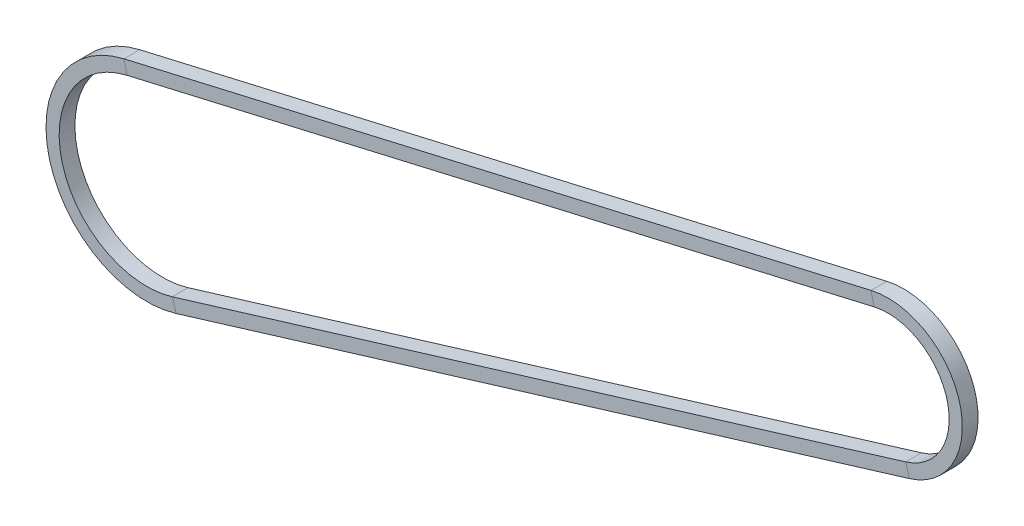
ISO-10303-21;
HEADER;
FILE_DESCRIPTION(('STEP AP214'),'2;1');
FILE_NAME('part.step','',(''),(''),'','','');
FILE_SCHEMA(('AUTOMOTIVE_DESIGN { 1 0 10303 214 1 1 1 1 }'));
ENDSEC;
DATA;
#1=APPLICATION_CONTEXT('core data for automotive mechanical design processes');
#2=APPLICATION_PROTOCOL_DEFINITION('international standard','automotive_design',2000,#1);
#3=PRODUCT_CONTEXT('',#1,'mechanical');
#4=PRODUCT('Part','Part','',(#3));
#5=PRODUCT_RELATED_PRODUCT_CATEGORY('part','',(#4));
#6=PRODUCT_DEFINITION_FORMATION('','',#4);
#7=PRODUCT_DEFINITION_CONTEXT('part definition',#1,'design');
#8=PRODUCT_DEFINITION('design','',#6,#7);
#9=PRODUCT_DEFINITION_SHAPE('','',#8);
#10=(LENGTH_UNIT() NAMED_UNIT(*) SI_UNIT(.MILLI.,.METRE.));
#11=(NAMED_UNIT(*) PLANE_ANGLE_UNIT() SI_UNIT($,.RADIAN.));
#12=(NAMED_UNIT(*) SI_UNIT($,.STERADIAN.) SOLID_ANGLE_UNIT());
#13=UNCERTAINTY_MEASURE_WITH_UNIT(LENGTH_MEASURE(1.E-05),#10,'distance_accuracy_value','');
#14=(GEOMETRIC_REPRESENTATION_CONTEXT(3) GLOBAL_UNCERTAINTY_ASSIGNED_CONTEXT((#13)) GLOBAL_UNIT_ASSIGNED_CONTEXT((#10,
#11,#12)) REPRESENTATION_CONTEXT('',''));
#15=CARTESIAN_POINT('',(0.,0.,0.));
#16=DIRECTION('',(0.,0.,1.));
#17=DIRECTION('',(1.,0.,0.));
#18=AXIS2_PLACEMENT_3D('',#15,#16,#17);
#19=CARTESIAN_POINT('',(-42.2936856202204,-11.3325589068733,0.));
#20=DIRECTION('',(0.,0.,-1.));
#21=DIRECTION('',(-1.,0.,0.));
#22=AXIS2_PLACEMENT_3D('',#19,#20,#21);
#23=CYLINDRICAL_SURFACE('',#22,5.74999999999999);
#24=CARTESIAN_POINT('',(-42.2936856202204,-11.3325589068733,-0.45));
#25=DIRECTION('',(0.,0.,-1.));
#26=DIRECTION('',(0.291757622308193,-0.956492284247536,0.));
#27=AXIS2_PLACEMENT_3D('',#24,#25,#26);
#28=CIRCLE('',#27,5.74999999999999);
#29=CARTESIAN_POINT('',(-40.6160792919483,-16.8323895412966,-0.45));
#30=VERTEX_POINT('',#29);
#31=CARTESIAN_POINT('',(-43.590751239599,-5.73076269681473,-0.45));
#32=VERTEX_POINT('',#31);
#33=EDGE_CURVE('E11',#30,#32,#28,.T.);
#34=ORIENTED_EDGE('',*,*,#33,.F.);
#35=DIRECTION('',(0.,0.,1.));
#36=VECTOR('',#35,1.);
#37=CARTESIAN_POINT('',(-40.6160792919483,-16.8323895412966,0.45));
#38=LINE('',#37,#36);
#39=CARTESIAN_POINT('',(-40.6160792919483,-16.8323895412966,0.45));
#40=VERTEX_POINT('',#39);
#41=EDGE_CURVE('E42',#30,#40,#38,.T.);
#42=ORIENTED_EDGE('',*,*,#41,.T.);
#43=CARTESIAN_POINT('',(-42.2936856202204,-11.3325589068733,0.45));
#44=DIRECTION('',(0.,0.,-1.));
#45=DIRECTION('',(0.291757622308193,-0.956492284247536,0.));
#46=AXIS2_PLACEMENT_3D('',#43,#44,#45);
#47=CIRCLE('',#46,5.74999999999999);
#48=CARTESIAN_POINT('',(-43.590751239599,-5.73076269681473,0.45));
#49=VERTEX_POINT('',#48);
#50=EDGE_CURVE('E124',#40,#49,#47,.T.);
#51=ORIENTED_EDGE('',*,*,#50,.T.);
#52=DIRECTION('',(0.,0.,1.));
#53=VECTOR('',#52,1.);
#54=CARTESIAN_POINT('',(-43.590751239599,-5.73076269681473,0.45));
#55=LINE('',#54,#53);
#56=EDGE_CURVE('E127',#32,#49,#55,.T.);
#57=ORIENTED_EDGE('',*,*,#56,.F.);
#58=EDGE_LOOP('',(#34,#42,#51,#57));
#59=FACE_BOUND('',#58,.T.);
#60=ADVANCED_FACE('F39',(#59),#23,.T.);
#61=CARTESIAN_POINT('',(-40.6160792919483,-16.8323895412966,-0.45));
#62=DIRECTION('',(0.,0.,-1.));
#63=DIRECTION('',(-1.,0.,0.));
#64=AXIS2_PLACEMENT_3D('',#61,#62,#63);
#65=PLANE('',#64);
#66=CARTESIAN_POINT('',(-42.2936856202204,-11.3325589068733,-0.45));
#67=DIRECTION('',(0.,0.,-1.));
#68=DIRECTION('',(0.291757622308195,-0.956492284247536,0.));
#69=AXIS2_PLACEMENT_3D('',#66,#67,#68);
#70=CIRCLE('',#69,5.);
#71=CARTESIAN_POINT('',(-40.8348975086795,-16.1150203281109,-0.45));
#72=VERTEX_POINT('',#71);
#73=CARTESIAN_POINT('',(-43.4215687675061,-6.46143176769193,-0.45));
#74=VERTEX_POINT('',#73);
#75=EDGE_CURVE('E47',#72,#74,#70,.T.);
#76=ORIENTED_EDGE('',*,*,#75,.F.);
#77=DIRECTION('',(0.291757622308196,-0.956492284247535,0.));
#78=VECTOR('',#77,1.);
#79=CARTESIAN_POINT('',(-40.6160792919483,-16.8323895412966,-0.45));
#80=LINE('',#79,#78);
#81=EDGE_CURVE('E193',#72,#30,#80,.T.);
#82=ORIENTED_EDGE('',*,*,#81,.T.);
#83=ORIENTED_EDGE('',*,*,#33,.T.);
#84=DIRECTION('',(-0.225576629457139,0.974225427836267,0.));
#85=VECTOR('',#84,1.);
#86=CARTESIAN_POINT('',(-43.590751239599,-5.73076269681473,-0.45));
#87=LINE('',#86,#85);
#88=EDGE_CURVE('E152',#74,#32,#87,.T.);
#89=ORIENTED_EDGE('',*,*,#88,.F.);
#90=EDGE_LOOP('',(#76,#82,#83,#89));
#91=FACE_BOUND('',#90,.T.);
#92=ADVANCED_FACE('F233',(#91),#65,.T.);
#93=CARTESIAN_POINT('',(-42.2936856202204,-11.3325589068733,0.));
#94=DIRECTION('',(0.,0.,-1.));
#95=DIRECTION('',(-1.,0.,0.));
#96=AXIS2_PLACEMENT_3D('',#93,#94,#95);
#97=CYLINDRICAL_SURFACE('',#96,5.);
#98=CARTESIAN_POINT('',(-42.2936856202204,-11.3325589068733,0.45));
#99=DIRECTION('',(0.,0.,-1.));
#100=DIRECTION('',(0.291757622308195,-0.956492284247536,0.));
#101=AXIS2_PLACEMENT_3D('',#98,#99,#100);
#102=CIRCLE('',#101,5.);
#103=CARTESIAN_POINT('',(-40.8348975086795,-16.1150203281109,0.45));
#104=VERTEX_POINT('',#103);
#105=CARTESIAN_POINT('',(-43.4215687675061,-6.46143176769193,0.45));
#106=VERTEX_POINT('',#105);
#107=EDGE_CURVE('E133',#104,#106,#102,.T.);
#108=ORIENTED_EDGE('',*,*,#107,.F.);
#109=DIRECTION('',(0.,0.,-1.));
#110=VECTOR('',#109,1.);
#111=CARTESIAN_POINT('',(-40.8348975086795,-16.1150203281109,0.45));
#112=LINE('',#111,#110);
#113=EDGE_CURVE('E177',#104,#72,#112,.T.);
#114=ORIENTED_EDGE('',*,*,#113,.T.);
#115=ORIENTED_EDGE('',*,*,#75,.T.);
#116=DIRECTION('',(0.,0.,-1.));
#117=VECTOR('',#116,1.);
#118=CARTESIAN_POINT('',(-43.4215687675061,-6.46143176769193,0.45));
#119=LINE('',#118,#117);
#120=EDGE_CURVE('E157',#106,#74,#119,.T.);
#121=ORIENTED_EDGE('',*,*,#120,.F.);
#122=EDGE_LOOP('',(#108,#114,#115,#121));
#123=FACE_BOUND('',#122,.T.);
#124=ADVANCED_FACE('F229',(#123),#97,.F.);
#125=CARTESIAN_POINT('',(1.23996989480991,-4.06509220805125,0.45));
#126=DIRECTION('',(0.291757622308192,-0.956492284247537,0.));
#127=DIRECTION('',(0.956492284247537,0.291757622308192,0.));
#128=AXIS2_PLACEMENT_3D('',#125,#126,#127);
#129=PLANE('',#128);
#130=ORIENTED_EDGE('',*,*,#41,.F.);
#131=DIRECTION('',(-0.956492284247537,-0.291757622308192,0.));
#132=VECTOR('',#131,1.);
#133=CARTESIAN_POINT('',(1.23996989480991,-4.06509220805125,-0.45));
#134=LINE('',#133,#132);
#135=CARTESIAN_POINT('',(1.2399698948099,-4.06509220805125,-0.45));
#136=VERTEX_POINT('',#135);
#137=EDGE_CURVE('E55',#136,#30,#134,.T.);
#138=ORIENTED_EDGE('',*,*,#137,.F.);
#139=DIRECTION('',(0.,0.,1.));
#140=VECTOR('',#139,1.);
#141=CARTESIAN_POINT('',(1.23996989480991,-4.06509220805126,0.45));
#142=LINE('',#141,#140);
#143=CARTESIAN_POINT('',(1.2399698948099,-4.06509220805125,0.45));
#144=VERTEX_POINT('',#143);
#145=EDGE_CURVE('E181',#136,#144,#142,.T.);
#146=ORIENTED_EDGE('',*,*,#145,.T.);
#147=DIRECTION('',(-0.956492284247537,-0.291757622308192,0.));
#148=VECTOR('',#147,1.);
#149=CARTESIAN_POINT('',(1.23996989480991,-4.06509220805125,0.45));
#150=LINE('',#149,#148);
#151=EDGE_CURVE('E179',#144,#40,#150,.T.);
#152=ORIENTED_EDGE('',*,*,#151,.T.);
#153=EDGE_LOOP('',(#130,#138,#146,#152));
#154=FACE_BOUND('',#153,.T.);
#155=ADVANCED_FACE('F208',(#154),#129,.T.);
#156=CARTESIAN_POINT('',(1.23996989480991,-4.06509220805125,-0.45));
#157=DIRECTION('',(0.,0.,-1.));
#158=DIRECTION('',(0.,1.,0.));
#159=AXIS2_PLACEMENT_3D('',#156,#157,#158);
#160=PLANE('',#159);
#161=ORIENTED_EDGE('',*,*,#137,.T.);
#162=ORIENTED_EDGE('',*,*,#81,.F.);
#163=DIRECTION('',(-0.956492284247537,-0.291757622308192,0.));
#164=VECTOR('',#163,1.);
#165=CARTESIAN_POINT('',(1.02115167807876,-3.3477229948656,-0.45));
#166=LINE('',#165,#164);
#167=CARTESIAN_POINT('',(1.02115167807876,-3.3477229948656,-0.45));
#168=VERTEX_POINT('',#167);
#169=EDGE_CURVE('E64',#168,#72,#166,.T.);
#170=ORIENTED_EDGE('',*,*,#169,.F.);
#171=DIRECTION('',(0.291757622308196,-0.956492284247535,0.));
#172=VECTOR('',#171,1.);
#173=CARTESIAN_POINT('',(1.23996989480991,-4.06509220805126,-0.45));
#174=LINE('',#173,#172);
#175=EDGE_CURVE('E190',#168,#136,#174,.T.);
#176=ORIENTED_EDGE('',*,*,#175,.T.);
#177=EDGE_LOOP('',(#161,#162,#170,#176));
#178=FACE_BOUND('',#177,.T.);
#179=ADVANCED_FACE('F219',(#178),#160,.T.);
#180=CARTESIAN_POINT('',(1.02115167807876,-3.3477229948656,0.45));
#181=DIRECTION('',(-0.291757622308192,0.956492284247537,0.));
#182=DIRECTION('',(-0.956492284247537,-0.291757622308192,0.));
#183=AXIS2_PLACEMENT_3D('',#180,#181,#182);
#184=PLANE('',#183);
#185=ORIENTED_EDGE('',*,*,#169,.T.);
#186=ORIENTED_EDGE('',*,*,#113,.F.);
#187=DIRECTION('',(-0.956492284247537,-0.291757622308192,0.));
#188=VECTOR('',#187,1.);
#189=CARTESIAN_POINT('',(1.02115167807876,-3.3477229948656,0.45));
#190=LINE('',#189,#188);
#191=CARTESIAN_POINT('',(1.02115167807876,-3.3477229948656,0.45));
#192=VERTEX_POINT('',#191);
#193=EDGE_CURVE('E92',#192,#104,#190,.T.);
#194=ORIENTED_EDGE('',*,*,#193,.F.);
#195=DIRECTION('',(0.,0.,-1.));
#196=VECTOR('',#195,1.);
#197=CARTESIAN_POINT('',(1.02115167807876,-3.3477229948656,0.45));
#198=LINE('',#197,#196);
#199=EDGE_CURVE('E171',#192,#168,#198,.T.);
#200=ORIENTED_EDGE('',*,*,#199,.T.);
#201=EDGE_LOOP('',(#185,#186,#194,#200));
#202=FACE_BOUND('',#201,.T.);
#203=ADVANCED_FACE('F221',(#202),#184,.T.);
#204=CARTESIAN_POINT('',(1.23996989480991,-4.06509220805125,0.45));
#205=DIRECTION('',(0.,0.,1.));
#206=DIRECTION('',(0.,-1.,0.));
#207=AXIS2_PLACEMENT_3D('',#204,#205,#206);
#208=PLANE('',#207);
#209=ORIENTED_EDGE('',*,*,#193,.T.);
#210=DIRECTION('',(-0.291757622308196,0.956492284247535,0.));
#211=VECTOR('',#210,1.);
#212=CARTESIAN_POINT('',(-40.6160792919483,-16.8323895412966,0.45));
#213=LINE('',#212,#211);
#214=EDGE_CURVE('E175',#40,#104,#213,.T.);
#215=ORIENTED_EDGE('',*,*,#214,.F.);
#216=ORIENTED_EDGE('',*,*,#151,.F.);
#217=DIRECTION('',(-0.291757622308196,0.956492284247535,0.));
#218=VECTOR('',#217,1.);
#219=CARTESIAN_POINT('',(1.23996989480991,-4.06509220805126,0.45));
#220=LINE('',#219,#218);
#221=EDGE_CURVE('E166',#144,#192,#220,.T.);
#222=ORIENTED_EDGE('',*,*,#221,.T.);
#223=EDGE_LOOP('',(#209,#215,#216,#222));
#224=FACE_BOUND('',#223,.T.);
#225=ADVANCED_FACE('F227',(#224),#208,.T.);
#226=CARTESIAN_POINT('',(0.,7.72017187502153E-13,0.));
#227=DIRECTION('',(0.,0.,-1.));
#228=DIRECTION('',(-1.,0.,0.));
#229=AXIS2_PLACEMENT_3D('',#226,#227,#228);
#230=CYLINDRICAL_SURFACE('',#229,4.24999999999999);
#231=ORIENTED_EDGE('',*,*,#145,.F.);
#232=CARTESIAN_POINT('',(0.,7.72017187502153E-13,-0.45));
#233=DIRECTION('',(0.,0.,-1.));
#234=DIRECTION('',(-0.22557662945714,0.974225427836266,0.));
#235=AXIS2_PLACEMENT_3D('',#232,#233,#234);
#236=CIRCLE('',#235,4.24999999999999);
#237=CARTESIAN_POINT('',(-0.958700675192783,4.1404580683049,-0.45));
#238=VERTEX_POINT('',#237);
#239=EDGE_CURVE('E200',#238,#136,#236,.T.);
#240=ORIENTED_EDGE('',*,*,#239,.F.);
#241=DIRECTION('',(0.,0.,1.));
#242=VECTOR('',#241,1.);
#243=CARTESIAN_POINT('',(-0.958700675192776,4.14045806830491,0.45));
#244=LINE('',#243,#242);
#245=CARTESIAN_POINT('',(-0.958700675192783,4.1404580683049,0.45));
#246=VERTEX_POINT('',#245);
#247=EDGE_CURVE('E174',#238,#246,#244,.T.);
#248=ORIENTED_EDGE('',*,*,#247,.T.);
#249=CARTESIAN_POINT('',(0.,7.72017187502153E-13,0.45));
#250=DIRECTION('',(0.,0.,-1.));
#251=DIRECTION('',(-0.22557662945714,0.974225427836266,0.));
#252=AXIS2_PLACEMENT_3D('',#249,#250,#251);
#253=CIRCLE('',#252,4.24999999999999);
#254=EDGE_CURVE('E169',#246,#144,#253,.T.);
#255=ORIENTED_EDGE('',*,*,#254,.T.);
#256=EDGE_LOOP('',(#231,#240,#248,#255));
#257=FACE_BOUND('',#256,.T.);
#258=ADVANCED_FACE('F213',(#257),#230,.T.);
#259=CARTESIAN_POINT('',(-0.95870067519277,4.1404580683049,-0.45));
#260=DIRECTION('',(0.,0.,-1.));
#261=DIRECTION('',(-1.,0.,0.));
#262=AXIS2_PLACEMENT_3D('',#259,#260,#261);
#263=PLANE('',#262);
#264=ORIENTED_EDGE('',*,*,#239,.T.);
#265=ORIENTED_EDGE('',*,*,#175,.F.);
#266=CARTESIAN_POINT('',(0.,7.72017187502153E-13,-0.45));
#267=DIRECTION('',(0.,0.,-1.));
#268=DIRECTION('',(-0.225576629457141,0.974225427836266,0.));
#269=AXIS2_PLACEMENT_3D('',#266,#267,#268);
#270=CIRCLE('',#269,3.49999999999999);
#271=CARTESIAN_POINT('',(-0.789518203099929,3.4097889974277,-0.45));
#272=VERTEX_POINT('',#271);
#273=EDGE_CURVE('E105',#272,#168,#270,.T.);
#274=ORIENTED_EDGE('',*,*,#273,.F.);
#275=DIRECTION('',(-0.225576629457139,0.974225427836267,0.));
#276=VECTOR('',#275,1.);
#277=CARTESIAN_POINT('',(-0.958700675192776,4.14045806830491,-0.45));
#278=LINE('',#277,#276);
#279=EDGE_CURVE('E187',#272,#238,#278,.T.);
#280=ORIENTED_EDGE('',*,*,#279,.T.);
#281=EDGE_LOOP('',(#264,#265,#274,#280));
#282=FACE_BOUND('',#281,.T.);
#283=ADVANCED_FACE('F218',(#282),#263,.T.);
#284=CARTESIAN_POINT('',(0.,7.72017187502153E-13,0.));
#285=DIRECTION('',(0.,0.,-1.));
#286=DIRECTION('',(-1.,0.,0.));
#287=AXIS2_PLACEMENT_3D('',#284,#285,#286);
#288=CYLINDRICAL_SURFACE('',#287,3.49999999999999);
#289=ORIENTED_EDGE('',*,*,#273,.T.);
#290=ORIENTED_EDGE('',*,*,#199,.F.);
#291=CARTESIAN_POINT('',(0.,7.72017187502153E-13,0.45));
#292=DIRECTION('',(0.,0.,-1.));
#293=DIRECTION('',(-0.225576629457141,0.974225427836266,0.));
#294=AXIS2_PLACEMENT_3D('',#291,#292,#293);
#295=CIRCLE('',#294,3.49999999999999);
#296=CARTESIAN_POINT('',(-0.789518203099929,3.4097889974277,0.45));
#297=VERTEX_POINT('',#296);
#298=EDGE_CURVE('E111',#297,#192,#295,.T.);
#299=ORIENTED_EDGE('',*,*,#298,.F.);
#300=DIRECTION('',(0.,0.,-1.));
#301=VECTOR('',#300,1.);
#302=CARTESIAN_POINT('',(-0.789518203099922,3.40978899742771,0.45));
#303=LINE('',#302,#301);
#304=EDGE_CURVE('E164',#297,#272,#303,.T.);
#305=ORIENTED_EDGE('',*,*,#304,.T.);
#306=EDGE_LOOP('',(#289,#290,#299,#305));
#307=FACE_BOUND('',#306,.T.);
#308=ADVANCED_FACE('F251',(#307),#288,.F.);
#309=CARTESIAN_POINT('',(-0.95870067519277,4.1404580683049,0.45));
#310=DIRECTION('',(0.,0.,1.));
#311=DIRECTION('',(1.,0.,0.));
#312=AXIS2_PLACEMENT_3D('',#309,#310,#311);
#313=PLANE('',#312);
#314=ORIENTED_EDGE('',*,*,#298,.T.);
#315=ORIENTED_EDGE('',*,*,#221,.F.);
#316=ORIENTED_EDGE('',*,*,#254,.F.);
#317=DIRECTION('',(0.225576629457139,-0.974225427836267,0.));
#318=VECTOR('',#317,1.);
#319=CARTESIAN_POINT('',(-0.958700675192776,4.14045806830491,0.45));
#320=LINE('',#319,#318);
#321=EDGE_CURVE('E144',#246,#297,#320,.T.);
#322=ORIENTED_EDGE('',*,*,#321,.T.);
#323=EDGE_LOOP('',(#314,#315,#316,#322));
#324=FACE_BOUND('',#323,.T.);
#325=ADVANCED_FACE('F211',(#324),#313,.T.);
#326=CARTESIAN_POINT('',(-43.590751239599,-5.73076269681473,0.45));
#327=DIRECTION('',(-0.225576629457135,0.974225427836267,0.));
#328=DIRECTION('',(-0.974225427836268,-0.225576629457135,0.));
#329=AXIS2_PLACEMENT_3D('',#326,#327,#328);
#330=PLANE('',#329);
#331=ORIENTED_EDGE('',*,*,#247,.F.);
#332=DIRECTION('',(0.974225427836267,0.225576629457135,0.));
#333=VECTOR('',#332,1.);
#334=CARTESIAN_POINT('',(-43.590751239599,-5.73076269681473,-0.45));
#335=LINE('',#334,#333);
#336=EDGE_CURVE('E151',#32,#238,#335,.T.);
#337=ORIENTED_EDGE('',*,*,#336,.F.);
#338=ORIENTED_EDGE('',*,*,#56,.T.);
#339=DIRECTION('',(0.974225427836267,0.225576629457135,0.));
#340=VECTOR('',#339,1.);
#341=CARTESIAN_POINT('',(-43.590751239599,-5.73076269681473,0.45));
#342=LINE('',#341,#340);
#343=EDGE_CURVE('E139',#49,#246,#342,.T.);
#344=ORIENTED_EDGE('',*,*,#343,.T.);
#345=EDGE_LOOP('',(#331,#337,#338,#344));
#346=FACE_BOUND('',#345,.T.);
#347=ADVANCED_FACE('F149',(#346),#330,.T.);
#348=CARTESIAN_POINT('',(-43.590751239599,-5.73076269681473,-0.45));
#349=DIRECTION('',(0.,0.,-1.));
#350=DIRECTION('',(0.,1.,0.));
#351=AXIS2_PLACEMENT_3D('',#348,#349,#350);
#352=PLANE('',#351);
#353=ORIENTED_EDGE('',*,*,#336,.T.);
#354=ORIENTED_EDGE('',*,*,#279,.F.);
#355=DIRECTION('',(0.974225427836267,0.225576629457135,0.));
#356=VECTOR('',#355,1.);
#357=CARTESIAN_POINT('',(-43.4215687675061,-6.46143176769193,-0.45));
#358=LINE('',#357,#356);
#359=EDGE_CURVE('E184',#74,#272,#358,.T.);
#360=ORIENTED_EDGE('',*,*,#359,.F.);
#361=ORIENTED_EDGE('',*,*,#88,.T.);
#362=EDGE_LOOP('',(#353,#354,#360,#361));
#363=FACE_BOUND('',#362,.T.);
#364=ADVANCED_FACE('F215',(#363),#352,.T.);
#365=CARTESIAN_POINT('',(-43.4215687675061,-6.46143176769193,0.45));
#366=DIRECTION('',(0.225576629457135,-0.974225427836267,0.));
#367=DIRECTION('',(0.974225427836268,0.225576629457135,0.));
#368=AXIS2_PLACEMENT_3D('',#365,#366,#367);
#369=PLANE('',#368);
#370=ORIENTED_EDGE('',*,*,#359,.T.);
#371=ORIENTED_EDGE('',*,*,#304,.F.);
#372=DIRECTION('',(0.974225427836267,0.225576629457135,0.));
#373=VECTOR('',#372,1.);
#374=CARTESIAN_POINT('',(-43.4215687675061,-6.46143176769193,0.45));
#375=LINE('',#374,#373);
#376=EDGE_CURVE('E163',#106,#297,#375,.T.);
#377=ORIENTED_EDGE('',*,*,#376,.F.);
#378=ORIENTED_EDGE('',*,*,#120,.T.);
#379=EDGE_LOOP('',(#370,#371,#377,#378));
#380=FACE_BOUND('',#379,.T.);
#381=ADVANCED_FACE('F260',(#380),#369,.T.);
#382=CARTESIAN_POINT('',(-43.590751239599,-5.73076269681473,0.45));
#383=DIRECTION('',(0.,0.,1.));
#384=DIRECTION('',(0.,-1.,0.));
#385=AXIS2_PLACEMENT_3D('',#382,#383,#384);
#386=PLANE('',#385);
#387=ORIENTED_EDGE('',*,*,#376,.T.);
#388=ORIENTED_EDGE('',*,*,#321,.F.);
#389=ORIENTED_EDGE('',*,*,#343,.F.);
#390=DIRECTION('',(0.225576629457139,-0.974225427836267,0.));
#391=VECTOR('',#390,1.);
#392=CARTESIAN_POINT('',(-43.590751239599,-5.73076269681473,0.45));
#393=LINE('',#392,#391);
#394=EDGE_CURVE('E142',#49,#106,#393,.T.);
#395=ORIENTED_EDGE('',*,*,#394,.T.);
#396=EDGE_LOOP('',(#387,#388,#389,#395));
#397=FACE_BOUND('',#396,.T.);
#398=ADVANCED_FACE('F141',(#397),#386,.T.);
#399=CARTESIAN_POINT('',(-40.6160792919483,-16.8323895412966,0.45));
#400=DIRECTION('',(0.,0.,1.));
#401=DIRECTION('',(1.,0.,0.));
#402=AXIS2_PLACEMENT_3D('',#399,#400,#401);
#403=PLANE('',#402);
#404=ORIENTED_EDGE('',*,*,#214,.T.);
#405=ORIENTED_EDGE('',*,*,#107,.T.);
#406=ORIENTED_EDGE('',*,*,#394,.F.);
#407=ORIENTED_EDGE('',*,*,#50,.F.);
#408=EDGE_LOOP('',(#404,#405,#406,#407));
#409=FACE_BOUND('',#408,.T.);
#410=ADVANCED_FACE('F154',(#409),#403,.T.);
#411=CLOSED_SHELL('',(#60,#92,#124,#155,#179,#203,#225,#258,#283,#308,#325,#347,#364,#381,#398,#410));
#412=MANIFOLD_SOLID_BREP('B2',#411);
#413=ADVANCED_BREP_SHAPE_REPRESENTATION('',(#18,#412),#14);
#414=SHAPE_DEFINITION_REPRESENTATION(#9,#413);
ENDSEC;
END-ISO-10303-21;
